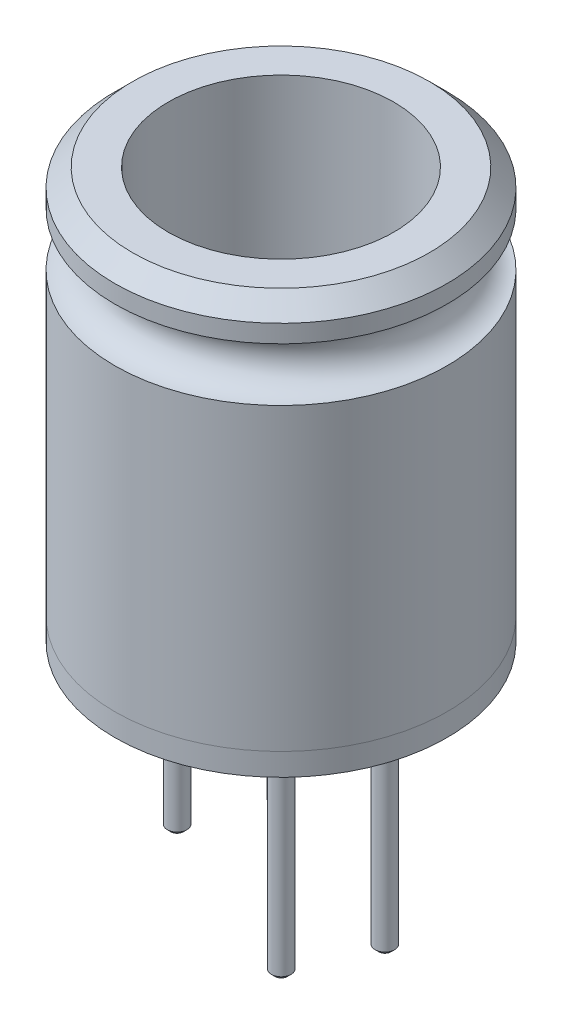
ISO-10303-21;
HEADER;
FILE_DESCRIPTION(('STEP AP214'),'2;1');
FILE_NAME('part.step','',(''),(''),'','','');
FILE_SCHEMA(('AUTOMOTIVE_DESIGN { 1 0 10303 214 1 1 1 1 }'));
ENDSEC;
DATA;
#1=APPLICATION_CONTEXT('core data for automotive mechanical design processes');
#2=APPLICATION_PROTOCOL_DEFINITION('international standard','automotive_design',2000,#1);
#3=PRODUCT_CONTEXT('',#1,'mechanical');
#4=PRODUCT('Part','Part','',(#3));
#5=PRODUCT_RELATED_PRODUCT_CATEGORY('part','',(#4));
#6=PRODUCT_DEFINITION_FORMATION('','',#4);
#7=PRODUCT_DEFINITION_CONTEXT('part definition',#1,'design');
#8=PRODUCT_DEFINITION('design','',#6,#7);
#9=PRODUCT_DEFINITION_SHAPE('','',#8);
#10=(LENGTH_UNIT() NAMED_UNIT(*) SI_UNIT(.MILLI.,.METRE.));
#11=(NAMED_UNIT(*) PLANE_ANGLE_UNIT() SI_UNIT($,.RADIAN.));
#12=(NAMED_UNIT(*) SI_UNIT($,.STERADIAN.) SOLID_ANGLE_UNIT());
#13=UNCERTAINTY_MEASURE_WITH_UNIT(LENGTH_MEASURE(1.E-05),#10,'distance_accuracy_value','');
#14=(GEOMETRIC_REPRESENTATION_CONTEXT(3) GLOBAL_UNCERTAINTY_ASSIGNED_CONTEXT((#13)) GLOBAL_UNIT_ASSIGNED_CONTEXT((#10,
#11,#12)) REPRESENTATION_CONTEXT('',''));
#15=CARTESIAN_POINT('',(0.,0.,0.));
#16=DIRECTION('',(0.,0.,1.));
#17=DIRECTION('',(1.,0.,0.));
#18=AXIS2_PLACEMENT_3D('',#15,#16,#17);
#19=CARTESIAN_POINT('',(-2.06475180106472,-6.,-2.06475180106472));
#20=DIRECTION('',(0.,-1.,0.));
#21=DIRECTION('',(0.,0.,-1.));
#22=AXIS2_PLACEMENT_3D('',#19,#20,#21);
#23=PLANE('',#22);
#24=CARTESIAN_POINT('',(-2.06475180106472,-6.00000000002865,-2.06475180106472));
#25=DIRECTION('',(0.,1.,0.));
#26=DIRECTION('',(0.,0.,1.));
#27=AXIS2_PLACEMENT_3D('',#24,#25,#26);
#28=CIRCLE('',#27,0.174999999948883);
#29=CARTESIAN_POINT('',(-2.06475180106472,-6.00000000002865,-1.88975180111584));
#30=VERTEX_POINT('',#29);
#31=EDGE_CURVE('P0_E18',#30,#30,#28,.T.);
#32=ORIENTED_EDGE('',*,*,#31,.F.);
#33=EDGE_LOOP('',(#32));
#34=FACE_BOUND('',#33,.T.);
#35=ADVANCED_FACE('P0_F15',(#34),#23,.T.);
#36=CARTESIAN_POINT('',(-2.06475180106472,-5.90000000005375,-2.06475180106472));
#37=DIRECTION('',(0.,1.,0.));
#38=DIRECTION('',(0.,0.,1.));
#39=AXIS2_PLACEMENT_3D('',#36,#37,#38);
#40=CONICAL_SURFACE('',#39,0.274999999923781,0.785398163397448);
#41=CARTESIAN_POINT('',(-2.06475180106472,-5.9,-2.06475180106472));
#42=DIRECTION('',(0.,1.,0.));
#43=DIRECTION('',(0.,0.,1.));
#44=AXIS2_PLACEMENT_3D('',#41,#42,#43);
#45=CIRCLE('',#44,0.275);
#46=CARTESIAN_POINT('',(-2.06475180106472,-5.9,-1.78975180106472));
#47=VERTEX_POINT('',#46);
#48=EDGE_CURVE('P0_E22',#47,#47,#45,.T.);
#49=ORIENTED_EDGE('',*,*,#48,.F.);
#50=EDGE_LOOP('',(#49));
#51=FACE_BOUND('',#50,.T.);
#52=ORIENTED_EDGE('',*,*,#31,.T.);
#53=EDGE_LOOP('',(#52));
#54=FACE_BOUND('',#53,.T.);
#55=ADVANCED_FACE('P0_F32',(#51,#54),#40,.T.);
#56=CARTESIAN_POINT('',(-2.06475180106472,0.,-2.06475180106472));
#57=DIRECTION('',(0.,-1.,0.));
#58=DIRECTION('',(0.,0.,-1.));
#59=AXIS2_PLACEMENT_3D('',#56,#57,#58);
#60=PLANE('',#59);
#61=CARTESIAN_POINT('',(-2.06475180106472,0.,-2.06475180106472));
#62=DIRECTION('',(0.,1.,0.));
#63=DIRECTION('',(0.,0.,1.));
#64=AXIS2_PLACEMENT_3D('',#61,#62,#63);
#65=CIRCLE('',#64,0.275);
#66=CARTESIAN_POINT('',(-2.06475180106472,0.,-1.78975180106472));
#67=VERTEX_POINT('',#66);
#68=EDGE_CURVE('P0_E10',#67,#67,#65,.F.);
#69=ORIENTED_EDGE('',*,*,#68,.F.);
#70=EDGE_LOOP('',(#69));
#71=FACE_BOUND('',#70,.T.);
#72=ADVANCED_FACE('P0_F39',(#71),#60,.F.);
#73=CARTESIAN_POINT('',(-2.06475180106472,-6.,-2.06475180106472));
#74=DIRECTION('',(0.,1.,0.));
#75=DIRECTION('',(0.,0.,1.));
#76=AXIS2_PLACEMENT_3D('',#73,#74,#75);
#77=CYLINDRICAL_SURFACE('',#76,0.275);
#78=ORIENTED_EDGE('',*,*,#68,.T.);
#79=EDGE_LOOP('',(#78));
#80=FACE_BOUND('',#79,.T.);
#81=ORIENTED_EDGE('',*,*,#48,.T.);
#82=EDGE_LOOP('',(#81));
#83=FACE_BOUND('',#82,.T.);
#84=ADVANCED_FACE('P0_F41',(#80,#83),#77,.T.);
#85=CLOSED_SHELL('',(#35,#55,#72,#84));
#86=MANIFOLD_SOLID_BREP('P0_B1',#85);
#87=CARTESIAN_POINT('',(0.,11.0500000001252,0.));
#88=DIRECTION('',(0.,-1.,0.));
#89=DIRECTION('',(0.,0.,-1.));
#90=AXIS2_PLACEMENT_3D('',#87,#88,#89);
#91=CONICAL_SURFACE('',#90,4.66999999991913,0.785398163397448);
#92=CARTESIAN_POINT('',(0.,11.05,0.));
#93=DIRECTION('',(0.,-1.,0.));
#94=DIRECTION('',(0.,0.,-1.));
#95=AXIS2_PLACEMENT_3D('',#92,#93,#94);
#96=CIRCLE('',#95,4.67);
#97=CARTESIAN_POINT('',(0.,11.05,-4.67));
#98=VERTEX_POINT('',#97);
#99=EDGE_CURVE('P1_E31',#98,#98,#96,.T.);
#100=ORIENTED_EDGE('',*,*,#99,.F.);
#101=EDGE_LOOP('',(#100));
#102=FACE_BOUND('',#101,.T.);
#103=CARTESIAN_POINT('',(0.,11.5500000000566,0.));
#104=DIRECTION('',(0.,-1.,0.));
#105=DIRECTION('',(0.,0.,-1.));
#106=AXIS2_PLACEMENT_3D('',#103,#104,#105);
#107=CIRCLE('',#106,4.16999999998779);
#108=CARTESIAN_POINT('',(0.,11.5500000000566,-4.16999999998779));
#109=VERTEX_POINT('',#108);
#110=EDGE_CURVE('P1_E18',#109,#109,#107,.F.);
#111=ORIENTED_EDGE('',*,*,#110,.F.);
#112=EDGE_LOOP('',(#111));
#113=FACE_BOUND('',#112,.T.);
#114=ADVANCED_FACE('P1_F15',(#102,#113),#91,.T.);
#115=CARTESIAN_POINT('',(0.,11.55,0.));
#116=DIRECTION('',(0.,-1.,0.));
#117=DIRECTION('',(0.,0.,-1.));
#118=AXIS2_PLACEMENT_3D('',#115,#116,#117);
#119=CYLINDRICAL_SURFACE('',#118,4.67);
#120=CARTESIAN_POINT('',(0.,10.55,0.));
#121=DIRECTION('',(0.,1.,0.));
#122=DIRECTION('',(0.,0.,1.));
#123=AXIS2_PLACEMENT_3D('',#120,#121,#122);
#124=CIRCLE('',#123,4.67);
#125=CARTESIAN_POINT('',(0.,10.55,4.67));
#126=VERTEX_POINT('',#125);
#127=EDGE_CURVE('P1_E36',#126,#126,#124,.T.);
#128=ORIENTED_EDGE('',*,*,#127,.T.);
#129=EDGE_LOOP('',(#128));
#130=FACE_BOUND('',#129,.T.);
#131=ORIENTED_EDGE('',*,*,#99,.T.);
#132=EDGE_LOOP('',(#131));
#133=FACE_BOUND('',#132,.T.);
#134=ADVANCED_FACE('P1_F59',(#130,#133),#119,.T.);
#135=CARTESIAN_POINT('',(0.,11.55,0.));
#136=DIRECTION('',(0.,1.,0.));
#137=DIRECTION('',(0.,0.,1.));
#138=AXIS2_PLACEMENT_3D('',#135,#136,#137);
#139=PLANE('',#138);
#140=CARTESIAN_POINT('',(0.,11.55,0.));
#141=DIRECTION('',(0.,-1.,0.));
#142=DIRECTION('',(0.,0.,-1.));
#143=AXIS2_PLACEMENT_3D('',#140,#141,#142);
#144=CIRCLE('',#143,3.17);
#145=CARTESIAN_POINT('',(0.,11.55,-3.17));
#146=VERTEX_POINT('',#145);
#147=EDGE_CURVE('P1_E34',#146,#146,#144,.T.);
#148=ORIENTED_EDGE('',*,*,#147,.T.);
#149=EDGE_LOOP('',(#148));
#150=FACE_BOUND('',#149,.T.);
#151=ORIENTED_EDGE('',*,*,#110,.T.);
#152=EDGE_LOOP('',(#151));
#153=FACE_BOUND('',#152,.T.);
#154=ADVANCED_FACE('P1_F56',(#150,#153),#139,.T.);
#155=CARTESIAN_POINT('',(0.,11.55,0.));
#156=DIRECTION('',(0.,-1.,0.));
#157=DIRECTION('',(0.,0.,-1.));
#158=AXIS2_PLACEMENT_3D('',#155,#156,#157);
#159=CYLINDRICAL_SURFACE('',#158,3.17);
#160=CARTESIAN_POINT('',(0.,0.63,0.));
#161=DIRECTION('',(0.,-1.,0.));
#162=DIRECTION('',(0.,0.,-1.));
#163=AXIS2_PLACEMENT_3D('',#160,#161,#162);
#164=CIRCLE('',#163,3.17);
#165=CARTESIAN_POINT('',(0.,0.63,-3.17));
#166=VERTEX_POINT('',#165);
#167=EDGE_CURVE('P1_E27',#166,#166,#164,.T.);
#168=ORIENTED_EDGE('',*,*,#167,.T.);
#169=EDGE_LOOP('',(#168));
#170=FACE_BOUND('',#169,.T.);
#171=ORIENTED_EDGE('',*,*,#147,.F.);
#172=EDGE_LOOP('',(#171));
#173=FACE_BOUND('',#172,.T.);
#174=ADVANCED_FACE('P1_F51',(#170,#173),#159,.F.);
#175=CARTESIAN_POINT('',(0.,9.8,0.));
#176=DIRECTION('',(0.,1.,0.));
#177=DIRECTION('',(0.,0.,1.));
#178=AXIS2_PLACEMENT_3D('',#175,#176,#177);
#179=TOROIDAL_SURFACE('',#178,4.67,0.75);
#180=ORIENTED_EDGE('',*,*,#127,.F.);
#181=EDGE_LOOP('',(#180));
#182=FACE_BOUND('',#181,.T.);
#183=CARTESIAN_POINT('',(0.,9.05,0.));
#184=DIRECTION('',(0.,-1.,0.));
#185=DIRECTION('',(0.,0.,-1.));
#186=AXIS2_PLACEMENT_3D('',#183,#184,#185);
#187=CIRCLE('',#186,4.67);
#188=CARTESIAN_POINT('',(0.,9.05,-4.67));
#189=VERTEX_POINT('',#188);
#190=EDGE_CURVE('P1_E22',#189,#189,#187,.T.);
#191=ORIENTED_EDGE('',*,*,#190,.F.);
#192=EDGE_LOOP('',(#191));
#193=FACE_BOUND('',#192,.T.);
#194=ADVANCED_FACE('P1_F46',(#182,#193),#179,.F.);
#195=CARTESIAN_POINT('',(0.,0.63,0.));
#196=DIRECTION('',(0.,1.,0.));
#197=DIRECTION('',(0.,0.,1.));
#198=AXIS2_PLACEMENT_3D('',#195,#196,#197);
#199=PLANE('',#198);
#200=ORIENTED_EDGE('',*,*,#167,.F.);
#201=EDGE_LOOP('',(#200));
#202=FACE_BOUND('',#201,.T.);
#203=CARTESIAN_POINT('',(0.,0.63,0.));
#204=DIRECTION('',(0.,-1.,0.));
#205=DIRECTION('',(0.,0.,-1.));
#206=AXIS2_PLACEMENT_3D('',#203,#204,#205);
#207=CIRCLE('',#206,4.67);
#208=CARTESIAN_POINT('',(0.,0.63,-4.67));
#209=VERTEX_POINT('',#208);
#210=EDGE_CURVE('P1_E10',#209,#209,#207,.F.);
#211=ORIENTED_EDGE('',*,*,#210,.F.);
#212=EDGE_LOOP('',(#211));
#213=FACE_BOUND('',#212,.T.);
#214=ADVANCED_FACE('P1_F50',(#202,#213),#199,.F.);
#215=CARTESIAN_POINT('',(0.,11.55,0.));
#216=DIRECTION('',(0.,-1.,0.));
#217=DIRECTION('',(0.,0.,-1.));
#218=AXIS2_PLACEMENT_3D('',#215,#216,#217);
#219=CYLINDRICAL_SURFACE('',#218,4.67);
#220=ORIENTED_EDGE('',*,*,#210,.T.);
#221=EDGE_LOOP('',(#220));
#222=FACE_BOUND('',#221,.T.);
#223=ORIENTED_EDGE('',*,*,#190,.T.);
#224=EDGE_LOOP('',(#223));
#225=FACE_BOUND('',#224,.T.);
#226=ADVANCED_FACE('P1_F67',(#222,#225),#219,.T.);
#227=CLOSED_SHELL('',(#114,#134,#154,#174,#194,#214,#226));
#228=MANIFOLD_SOLID_BREP('P1_B1',#227);
#229=CARTESIAN_POINT('',(2.06476688288851,-6.,2.05756901955737));
#230=DIRECTION('',(0.,-1.,0.));
#231=DIRECTION('',(0.,0.,-1.));
#232=AXIS2_PLACEMENT_3D('',#229,#230,#231);
#233=PLANE('',#232);
#234=CARTESIAN_POINT('',(2.06476688288851,-5.99999999997181,2.05756901955737));
#235=DIRECTION('',(0.,1.,0.));
#236=DIRECTION('',(0.,0.,1.));
#237=AXIS2_PLACEMENT_3D('',#234,#235,#236);
#238=CIRCLE('',#237,0.174999999940167);
#239=CARTESIAN_POINT('',(2.06476688288851,-5.99999999997181,2.23256901949753));
#240=VERTEX_POINT('',#239);
#241=EDGE_CURVE('P2_E18',#240,#240,#238,.T.);
#242=ORIENTED_EDGE('',*,*,#241,.F.);
#243=EDGE_LOOP('',(#242));
#244=FACE_BOUND('',#243,.T.);
#245=ADVANCED_FACE('P2_F15',(#244),#233,.T.);
#246=CARTESIAN_POINT('',(2.06476688288851,-5.90000000005375,2.05756901955737));
#247=DIRECTION('',(0.,1.,0.));
#248=DIRECTION('',(0.,0.,1.));
#249=AXIS2_PLACEMENT_3D('',#246,#247,#248);
#250=CONICAL_SURFACE('',#249,0.274999999858222,0.785398163397448);
#251=CARTESIAN_POINT('',(2.06476688288851,-5.9,2.05756901955737));
#252=DIRECTION('',(0.,1.,0.));
#253=DIRECTION('',(0.,0.,1.));
#254=AXIS2_PLACEMENT_3D('',#251,#252,#253);
#255=CIRCLE('',#254,0.275);
#256=CARTESIAN_POINT('',(2.06476688288851,-5.9,2.33256901955736));
#257=VERTEX_POINT('',#256);
#258=EDGE_CURVE('P2_E22',#257,#257,#255,.T.);
#259=ORIENTED_EDGE('',*,*,#258,.F.);
#260=EDGE_LOOP('',(#259));
#261=FACE_BOUND('',#260,.T.);
#262=ORIENTED_EDGE('',*,*,#241,.T.);
#263=EDGE_LOOP('',(#262));
#264=FACE_BOUND('',#263,.T.);
#265=ADVANCED_FACE('P2_F32',(#261,#264),#250,.T.);
#266=CARTESIAN_POINT('',(2.06476688288851,0.,2.05756901955737));
#267=DIRECTION('',(0.,-1.,0.));
#268=DIRECTION('',(0.,0.,-1.));
#269=AXIS2_PLACEMENT_3D('',#266,#267,#268);
#270=PLANE('',#269);
#271=CARTESIAN_POINT('',(2.06476688288851,0.,2.05756901955737));
#272=DIRECTION('',(0.,1.,0.));
#273=DIRECTION('',(0.,0.,1.));
#274=AXIS2_PLACEMENT_3D('',#271,#272,#273);
#275=CIRCLE('',#274,0.275);
#276=CARTESIAN_POINT('',(2.06476688288851,0.,2.33256901955736));
#277=VERTEX_POINT('',#276);
#278=EDGE_CURVE('P2_E10',#277,#277,#275,.F.);
#279=ORIENTED_EDGE('',*,*,#278,.F.);
#280=EDGE_LOOP('',(#279));
#281=FACE_BOUND('',#280,.T.);
#282=ADVANCED_FACE('P2_F39',(#281),#270,.F.);
#283=CARTESIAN_POINT('',(2.06476688288851,-6.,2.05756901955737));
#284=DIRECTION('',(0.,1.,0.));
#285=DIRECTION('',(0.,0.,1.));
#286=AXIS2_PLACEMENT_3D('',#283,#284,#285);
#287=CYLINDRICAL_SURFACE('',#286,0.275);
#288=ORIENTED_EDGE('',*,*,#278,.T.);
#289=EDGE_LOOP('',(#288));
#290=FACE_BOUND('',#289,.T.);
#291=ORIENTED_EDGE('',*,*,#258,.T.);
#292=EDGE_LOOP('',(#291));
#293=FACE_BOUND('',#292,.T.);
#294=ADVANCED_FACE('P2_F41',(#290,#293),#287,.T.);
#295=CLOSED_SHELL('',(#245,#265,#282,#294));
#296=MANIFOLD_SOLID_BREP('P2_B1',#295);
#297=CARTESIAN_POINT('',(-2.92,-6.,0.));
#298=DIRECTION('',(0.,-1.,0.));
#299=DIRECTION('',(0.,0.,-1.));
#300=AXIS2_PLACEMENT_3D('',#297,#298,#299);
#301=PLANE('',#300);
#302=CARTESIAN_POINT('',(-2.92,-5.99999999997181,0.));
#303=DIRECTION('',(0.,1.,0.));
#304=DIRECTION('',(-1.,0.,0.));
#305=AXIS2_PLACEMENT_3D('',#302,#303,#304);
#306=CIRCLE('',#305,0.175000000012915);
#307=CARTESIAN_POINT('',(-3.09500000001291,-5.99999999997181,0.));
#308=VERTEX_POINT('',#307);
#309=EDGE_CURVE('P3_E18',#308,#308,#306,.T.);
#310=ORIENTED_EDGE('',*,*,#309,.F.);
#311=EDGE_LOOP('',(#310));
#312=FACE_BOUND('',#311,.T.);
#313=ADVANCED_FACE('P3_F15',(#312),#301,.T.);
#314=CARTESIAN_POINT('',(-2.92,-5.89999999999691,0.));
#315=DIRECTION('',(0.,1.,0.));
#316=DIRECTION('',(-1.,0.,0.));
#317=AXIS2_PLACEMENT_3D('',#314,#315,#316);
#318=CONICAL_SURFACE('',#317,0.274999999930969,0.785398163113231);
#319=CARTESIAN_POINT('',(-2.92,-5.9,0.));
#320=DIRECTION('',(0.,1.,0.));
#321=DIRECTION('',(0.,0.,1.));
#322=AXIS2_PLACEMENT_3D('',#319,#320,#321);
#323=CIRCLE('',#322,0.275);
#324=CARTESIAN_POINT('',(-2.92,-5.9,0.275));
#325=VERTEX_POINT('',#324);
#326=EDGE_CURVE('P3_E22',#325,#325,#323,.T.);
#327=ORIENTED_EDGE('',*,*,#326,.F.);
#328=EDGE_LOOP('',(#327));
#329=FACE_BOUND('',#328,.T.);
#330=ORIENTED_EDGE('',*,*,#309,.T.);
#331=EDGE_LOOP('',(#330));
#332=FACE_BOUND('',#331,.T.);
#333=ADVANCED_FACE('P3_F32',(#329,#332),#318,.T.);
#334=CARTESIAN_POINT('',(-2.92,0.,0.));
#335=DIRECTION('',(0.,-1.,0.));
#336=DIRECTION('',(0.,0.,-1.));
#337=AXIS2_PLACEMENT_3D('',#334,#335,#336);
#338=PLANE('',#337);
#339=CARTESIAN_POINT('',(-2.92,0.,0.));
#340=DIRECTION('',(0.,1.,0.));
#341=DIRECTION('',(0.,0.,1.));
#342=AXIS2_PLACEMENT_3D('',#339,#340,#341);
#343=CIRCLE('',#342,0.275);
#344=CARTESIAN_POINT('',(-2.92,0.,0.275));
#345=VERTEX_POINT('',#344);
#346=EDGE_CURVE('P3_E10',#345,#345,#343,.F.);
#347=ORIENTED_EDGE('',*,*,#346,.F.);
#348=EDGE_LOOP('',(#347));
#349=FACE_BOUND('',#348,.T.);
#350=ADVANCED_FACE('P3_F39',(#349),#338,.F.);
#351=CARTESIAN_POINT('',(-2.92,-6.,0.));
#352=DIRECTION('',(0.,1.,0.));
#353=DIRECTION('',(0.,0.,1.));
#354=AXIS2_PLACEMENT_3D('',#351,#352,#353);
#355=CYLINDRICAL_SURFACE('',#354,0.275);
#356=ORIENTED_EDGE('',*,*,#346,.T.);
#357=EDGE_LOOP('',(#356));
#358=FACE_BOUND('',#357,.T.);
#359=ORIENTED_EDGE('',*,*,#326,.T.);
#360=EDGE_LOOP('',(#359));
#361=FACE_BOUND('',#360,.T.);
#362=ADVANCED_FACE('P3_F41',(#358,#361),#355,.T.);
#363=CLOSED_SHELL('',(#313,#333,#350,#362));
#364=MANIFOLD_SOLID_BREP('P3_B1',#363);
#365=CARTESIAN_POINT('',(2.92,-0.1,0.));
#366=DIRECTION('',(0.,-1.,0.));
#367=DIRECTION('',(0.,0.,-1.));
#368=AXIS2_PLACEMENT_3D('',#365,#366,#367);
#369=PLANE('',#368);
#370=CARTESIAN_POINT('',(2.92,-0.1,0.));
#371=DIRECTION('',(0.,1.,0.));
#372=DIRECTION('',(0.,0.,-1.));
#373=AXIS2_PLACEMENT_3D('',#370,#371,#372);
#374=CIRCLE('',#373,0.386794919243112);
#375=CARTESIAN_POINT('',(2.92,-0.1,-0.386794919243112));
#376=VERTEX_POINT('',#375);
#377=CARTESIAN_POINT('',(2.92,-0.1,0.386794919243112));
#378=VERTEX_POINT('',#377);
#379=EDGE_CURVE('P4_E27',#376,#378,#374,.T.);
#380=ORIENTED_EDGE('',*,*,#379,.F.);
#381=CARTESIAN_POINT('',(2.92,-0.1,0.));
#382=DIRECTION('',(0.,1.,0.));
#383=DIRECTION('',(0.,0.,1.));
#384=AXIS2_PLACEMENT_3D('',#381,#382,#383);
#385=CIRCLE('',#384,0.386794919243112);
#386=EDGE_CURVE('P4_E36',#378,#376,#385,.T.);
#387=ORIENTED_EDGE('',*,*,#386,.F.);
#388=EDGE_LOOP('',(#380,#387));
#389=FACE_BOUND('',#388,.T.);
#390=ADVANCED_FACE('P4_F17',(#389),#369,.T.);
#391=CARTESIAN_POINT('',(2.92,0.1,0.));
#392=DIRECTION('',(0.,1.,0.));
#393=DIRECTION('',(0.,0.,1.));
#394=AXIS2_PLACEMENT_3D('',#391,#392,#393);
#395=TOROIDAL_SURFACE('',#394,0.386794919243112,0.2);
#396=ORIENTED_EDGE('',*,*,#386,.T.);
#397=ORIENTED_EDGE('',*,*,#379,.T.);
#398=EDGE_LOOP('',(#396,#397));
#399=FACE_BOUND('',#398,.T.);
#400=CARTESIAN_POINT('',(2.92,0.,0.));
#401=DIRECTION('',(0.,1.,0.));
#402=DIRECTION('',(0.,0.,1.));
#403=AXIS2_PLACEMENT_3D('',#400,#401,#402);
#404=CIRCLE('',#403,0.56);
#405=CARTESIAN_POINT('',(2.92,0.,0.56));
#406=VERTEX_POINT('',#405);
#407=EDGE_CURVE('P4_E11',#406,#406,#404,.F.);
#408=ORIENTED_EDGE('',*,*,#407,.T.);
#409=EDGE_LOOP('',(#408));
#410=FACE_BOUND('',#409,.T.);
#411=ADVANCED_FACE('P4_F37',(#399,#410),#395,.T.);
#412=CARTESIAN_POINT('',(2.92,0.,0.));
#413=DIRECTION('',(0.,-1.,0.));
#414=DIRECTION('',(0.,0.,-1.));
#415=AXIS2_PLACEMENT_3D('',#412,#413,#414);
#416=PLANE('',#415);
#417=ORIENTED_EDGE('',*,*,#407,.F.);
#418=EDGE_LOOP('',(#417));
#419=FACE_BOUND('',#418,.T.);
#420=ADVANCED_FACE('P4_F71',(#419),#416,.F.);
#421=CLOSED_SHELL('',(#390,#411,#420));
#422=MANIFOLD_SOLID_BREP('P4_B1',#421);
#423=CARTESIAN_POINT('',(0.,0.63,0.));
#424=DIRECTION('',(0.,1.,0.));
#425=DIRECTION('',(0.,0.,1.));
#426=AXIS2_PLACEMENT_3D('',#423,#424,#425);
#427=PLANE('',#426);
#428=DIRECTION('',(-0.923879532507222,0.,-0.382683432374903));
#429=VECTOR('',#428,1.);
#430=CARTESIAN_POINT('',(-5.27398780877437,0.63,-1.75160039813017));
#431=LINE('',#430,#429);
#432=CARTESIAN_POINT('',(-4.9968239490222,0.63,-1.6367953684177));
#433=VERTEX_POINT('',#432);
#434=CARTESIAN_POINT('',(-4.44645181707023,0.63,-1.40882376700415));
#435=VERTEX_POINT('',#434);
#436=EDGE_CURVE('P5_E112',#433,#435,#431,.F.);
#437=ORIENTED_EDGE('',*,*,#436,.T.);
#438=DIRECTION('',(0.382683432374663,0.,-0.923879532507321));
#439=VECTOR('',#438,1.);
#440=CARTESIAN_POINT('',(-4.1403050711705,0.63,-2.14792739301));
#441=LINE('',#440,#439);
#442=CARTESIAN_POINT('',(-4.1403050711705,0.63,-2.14792739301));
#443=VERTEX_POINT('',#442);
#444=EDGE_CURVE('P5_E67',#443,#435,#441,.F.);
#445=ORIENTED_EDGE('',*,*,#444,.F.);
#446=DIRECTION('',(-0.923879532507324,0.,-0.382683432374657));
#447=VECTOR('',#446,1.);
#448=CARTESIAN_POINT('',(-4.96784106287454,0.63,-2.49070402413573));
#449=LINE('',#448,#447);
#450=CARTESIAN_POINT('',(-4.69067720312242,0.63,-2.37589899442336));
#451=VERTEX_POINT('',#450);
#452=EDGE_CURVE('P5_E81',#451,#443,#449,.F.);
#453=ORIENTED_EDGE('',*,*,#452,.F.);
#454=CARTESIAN_POINT('',(-4.80548223283482,0.63,-2.09873513467116));
#455=DIRECTION('',(0.,1.,0.));
#456=DIRECTION('',(0.,0.,1.));
#457=AXIS2_PLACEMENT_3D('',#454,#455,#456);
#458=CIRCLE('',#457,0.3);
#459=CARTESIAN_POINT('',(-5.08264609258698,0.63,-2.21354016438363));
#460=VERTEX_POINT('',#459);
#461=EDGE_CURVE('P5_E83',#460,#451,#458,.F.);
#462=ORIENTED_EDGE('',*,*,#461,.F.);
#463=DIRECTION('',(0.382683432374895,0.,-0.923879532507225));
#464=VECTOR('',#463,1.);
#465=CARTESIAN_POINT('',(-4.96784106287454,0.63,-2.49070402413573));
#466=LINE('',#465,#464);
#467=CARTESIAN_POINT('',(-5.1591827790619,0.63,-2.02876425788233));
#468=VERTEX_POINT('',#467);
#469=EDGE_CURVE('P5_E113',#460,#468,#466,.F.);
#470=ORIENTED_EDGE('',*,*,#469,.T.);
#471=CARTESIAN_POINT('',(-4.88201891930973,0.63,-1.91395922816986));
#472=DIRECTION('',(0.,-1.,0.));
#473=DIRECTION('',(0.,0.,-1.));
#474=AXIS2_PLACEMENT_3D('',#471,#472,#473);
#475=CIRCLE('',#474,0.3);
#476=EDGE_CURVE('P5_E20',#433,#468,#475,.T.);
#477=ORIENTED_EDGE('',*,*,#476,.F.);
#478=EDGE_LOOP('',(#437,#445,#453,#462,#470,#477));
#479=FACE_BOUND('',#478,.T.);
#480=ADVANCED_FACE('P5_F17',(#479),#427,.T.);
#481=CARTESIAN_POINT('',(-4.88201891930973,0.63,-1.91395922816986));
#482=DIRECTION('',(0.,-1.,0.));
#483=DIRECTION('',(0.,0.,-1.));
#484=AXIS2_PLACEMENT_3D('',#481,#482,#483);
#485=CYLINDRICAL_SURFACE('',#484,0.3);
#486=CARTESIAN_POINT('',(-4.88201891930973,0.,-1.91395922816986));
#487=DIRECTION('',(0.,-1.,0.));
#488=DIRECTION('',(0.,0.,-1.));
#489=AXIS2_PLACEMENT_3D('',#486,#487,#488);
#490=CIRCLE('',#489,0.3);
#491=CARTESIAN_POINT('',(-5.1591827790619,0.,-2.02876425788233));
#492=VERTEX_POINT('',#491);
#493=CARTESIAN_POINT('',(-4.9968239490222,0.,-1.6367953684177));
#494=VERTEX_POINT('',#493);
#495=EDGE_CURVE('P5_E99',#492,#494,#490,.F.);
#496=ORIENTED_EDGE('',*,*,#495,.T.);
#497=DIRECTION('',(0.,1.,0.));
#498=VECTOR('',#497,1.);
#499=CARTESIAN_POINT('',(-4.9968239490222,0.63,-1.6367953684177));
#500=LINE('',#499,#498);
#501=EDGE_CURVE('P5_E109',#494,#433,#500,.T.);
#502=ORIENTED_EDGE('',*,*,#501,.T.);
#503=ORIENTED_EDGE('',*,*,#476,.T.);
#504=DIRECTION('',(0.,1.,0.));
#505=VECTOR('',#504,1.);
#506=CARTESIAN_POINT('',(-5.1591827790619,0.63,-2.02876425788233));
#507=LINE('',#506,#505);
#508=EDGE_CURVE('P5_E128',#468,#492,#507,.F.);
#509=ORIENTED_EDGE('',*,*,#508,.T.);
#510=EDGE_LOOP('',(#496,#502,#503,#509));
#511=FACE_BOUND('',#510,.T.);
#512=ADVANCED_FACE('P5_F189',(#511),#485,.T.);
#513=CARTESIAN_POINT('',(-5.27398780877437,0.63,-1.75160039813017));
#514=DIRECTION('',(0.382683432374903,0.,-0.923879532507222));
#515=DIRECTION('',(-0.923879532507222,0.,-0.382683432374903));
#516=AXIS2_PLACEMENT_3D('',#513,#514,#515);
#517=PLANE('',#516);
#518=ORIENTED_EDGE('',*,*,#501,.F.);
#519=DIRECTION('',(0.923879532507222,0.,0.382683432374903));
#520=VECTOR('',#519,1.);
#521=CARTESIAN_POINT('',(-4.9968239490222,0.,-1.6367953684177));
#522=LINE('',#521,#520);
#523=CARTESIAN_POINT('',(-4.44645181707023,0.,-1.40882376700415));
#524=VERTEX_POINT('',#523);
#525=EDGE_CURVE('P5_E97',#494,#524,#522,.T.);
#526=ORIENTED_EDGE('',*,*,#525,.T.);
#527=DIRECTION('',(0.,1.,0.));
#528=VECTOR('',#527,1.);
#529=CARTESIAN_POINT('',(-4.44645181707023,0.63,-1.40882376700415));
#530=LINE('',#529,#528);
#531=EDGE_CURVE('P5_E96',#435,#524,#530,.F.);
#532=ORIENTED_EDGE('',*,*,#531,.F.);
#533=ORIENTED_EDGE('',*,*,#436,.F.);
#534=EDGE_LOOP('',(#518,#526,#532,#533));
#535=FACE_BOUND('',#534,.T.);
#536=ADVANCED_FACE('P5_F180',(#535),#517,.F.);
#537=CARTESIAN_POINT('',(-4.1403050711705,0.63,-2.14792739301));
#538=DIRECTION('',(0.923879532507321,0.,0.382683432374663));
#539=DIRECTION('',(0.382683432374663,0.,-0.923879532507321));
#540=AXIS2_PLACEMENT_3D('',#537,#538,#539);
#541=PLANE('',#540);
#542=ORIENTED_EDGE('',*,*,#444,.T.);
#543=ORIENTED_EDGE('',*,*,#531,.T.);
#544=DIRECTION('',(0.382683432374663,0.,-0.923879532507321));
#545=VECTOR('',#544,1.);
#546=CARTESIAN_POINT('',(-4.44645181707023,0.,-1.40882376700415));
#547=LINE('',#546,#545);
#548=CARTESIAN_POINT('',(-4.1403050711705,0.,-2.14792739301));
#549=VERTEX_POINT('',#548);
#550=EDGE_CURVE('P5_E90',#524,#549,#547,.T.);
#551=ORIENTED_EDGE('',*,*,#550,.T.);
#552=DIRECTION('',(0.,1.,0.));
#553=VECTOR('',#552,1.);
#554=CARTESIAN_POINT('',(-4.1403050711705,0.63,-2.14792739301));
#555=LINE('',#554,#553);
#556=EDGE_CURVE('P5_E75',#443,#549,#555,.F.);
#557=ORIENTED_EDGE('',*,*,#556,.F.);
#558=EDGE_LOOP('',(#542,#543,#551,#557));
#559=FACE_BOUND('',#558,.T.);
#560=ADVANCED_FACE('P5_F94',(#559),#541,.T.);
#561=CARTESIAN_POINT('',(-4.96784106287454,0.63,-2.49070402413573));
#562=DIRECTION('',(0.382683432374657,0.,-0.923879532507324));
#563=DIRECTION('',(-0.923879532507324,0.,-0.382683432374657));
#564=AXIS2_PLACEMENT_3D('',#561,#562,#563);
#565=PLANE('',#564);
#566=ORIENTED_EDGE('',*,*,#452,.T.);
#567=ORIENTED_EDGE('',*,*,#556,.T.);
#568=DIRECTION('',(-0.923879532507324,0.,-0.382683432374657));
#569=VECTOR('',#568,1.);
#570=CARTESIAN_POINT('',(-4.1403050711705,0.,-2.14792739301));
#571=LINE('',#570,#569);
#572=CARTESIAN_POINT('',(-4.69067720312242,0.,-2.37589899442336));
#573=VERTEX_POINT('',#572);
#574=EDGE_CURVE('P5_E79',#549,#573,#571,.T.);
#575=ORIENTED_EDGE('',*,*,#574,.T.);
#576=DIRECTION('',(0.,1.,0.));
#577=VECTOR('',#576,1.);
#578=CARTESIAN_POINT('',(-4.69067720312242,0.63,-2.37589899442336));
#579=LINE('',#578,#577);
#580=EDGE_CURVE('P5_E126',#451,#573,#579,.F.);
#581=ORIENTED_EDGE('',*,*,#580,.F.);
#582=EDGE_LOOP('',(#566,#567,#575,#581));
#583=FACE_BOUND('',#582,.T.);
#584=ADVANCED_FACE('P5_F77',(#583),#565,.T.);
#585=CARTESIAN_POINT('',(-4.80548223283482,0.63,-2.09873513467116));
#586=DIRECTION('',(0.,1.,0.));
#587=DIRECTION('',(0.,0.,1.));
#588=AXIS2_PLACEMENT_3D('',#585,#586,#587);
#589=CYLINDRICAL_SURFACE('',#588,0.3);
#590=CARTESIAN_POINT('',(-4.80548223283482,0.,-2.09873513467116));
#591=DIRECTION('',(0.,1.,0.));
#592=DIRECTION('',(0.,0.,1.));
#593=AXIS2_PLACEMENT_3D('',#590,#591,#592);
#594=CIRCLE('',#593,0.3);
#595=CARTESIAN_POINT('',(-5.08264609258698,0.,-2.21354016438363));
#596=VERTEX_POINT('',#595);
#597=EDGE_CURVE('P5_E26',#573,#596,#594,.T.);
#598=ORIENTED_EDGE('',*,*,#597,.T.);
#599=DIRECTION('',(0.,1.,0.));
#600=VECTOR('',#599,1.);
#601=CARTESIAN_POINT('',(-5.08264609258698,0.63,-2.21354016438363));
#602=LINE('',#601,#600);
#603=EDGE_CURVE('P5_E34',#596,#460,#602,.T.);
#604=ORIENTED_EDGE('',*,*,#603,.T.);
#605=ORIENTED_EDGE('',*,*,#461,.T.);
#606=ORIENTED_EDGE('',*,*,#580,.T.);
#607=EDGE_LOOP('',(#598,#604,#605,#606));
#608=FACE_BOUND('',#607,.T.);
#609=ADVANCED_FACE('P5_F137',(#608),#589,.T.);
#610=CARTESIAN_POINT('',(-4.96784106287454,0.63,-2.49070402413573));
#611=DIRECTION('',(0.923879532507225,0.,0.382683432374895));
#612=DIRECTION('',(0.382683432374895,0.,-0.923879532507225));
#613=AXIS2_PLACEMENT_3D('',#610,#611,#612);
#614=PLANE('',#613);
#615=ORIENTED_EDGE('',*,*,#603,.F.);
#616=DIRECTION('',(-0.382683432374895,0.,0.923879532507225));
#617=VECTOR('',#616,1.);
#618=CARTESIAN_POINT('',(-5.08264609258698,0.,-2.21354016438363));
#619=LINE('',#618,#617);
#620=EDGE_CURVE('P5_E11',#596,#492,#619,.T.);
#621=ORIENTED_EDGE('',*,*,#620,.T.);
#622=ORIENTED_EDGE('',*,*,#508,.F.);
#623=ORIENTED_EDGE('',*,*,#469,.F.);
#624=EDGE_LOOP('',(#615,#621,#622,#623));
#625=FACE_BOUND('',#624,.T.);
#626=ADVANCED_FACE('P5_F139',(#625),#614,.F.);
#627=CARTESIAN_POINT('',(0.,0.,0.));
#628=DIRECTION('',(0.,1.,0.));
#629=DIRECTION('',(0.,0.,1.));
#630=AXIS2_PLACEMENT_3D('',#627,#628,#629);
#631=PLANE('',#630);
#632=ORIENTED_EDGE('',*,*,#597,.F.);
#633=ORIENTED_EDGE('',*,*,#574,.F.);
#634=ORIENTED_EDGE('',*,*,#550,.F.);
#635=ORIENTED_EDGE('',*,*,#525,.F.);
#636=ORIENTED_EDGE('',*,*,#495,.F.);
#637=ORIENTED_EDGE('',*,*,#620,.F.);
#638=EDGE_LOOP('',(#632,#633,#634,#635,#636,#637));
#639=FACE_BOUND('',#638,.T.);
#640=ADVANCED_FACE('P5_F88',(#639),#631,.F.);
#641=CLOSED_SHELL('',(#480,#512,#536,#560,#584,#609,#626,#640));
#642=MANIFOLD_SOLID_BREP('P5_B1',#641);
#643=CARTESIAN_POINT('',(2.92,-6.,0.));
#644=DIRECTION('',(0.,-1.,0.));
#645=DIRECTION('',(0.,0.,-1.));
#646=AXIS2_PLACEMENT_3D('',#643,#644,#645);
#647=PLANE('',#646);
#648=CARTESIAN_POINT('',(2.92,-5.99999999997181,0.));
#649=DIRECTION('',(0.,1.,0.));
#650=DIRECTION('',(-1.,0.,0.));
#651=AXIS2_PLACEMENT_3D('',#648,#649,#650);
#652=CIRCLE('',#651,0.175000000012915);
#653=CARTESIAN_POINT('',(2.74499999998709,-5.99999999997181,0.));
#654=VERTEX_POINT('',#653);
#655=EDGE_CURVE('P6_E18',#654,#654,#652,.T.);
#656=ORIENTED_EDGE('',*,*,#655,.F.);
#657=EDGE_LOOP('',(#656));
#658=FACE_BOUND('',#657,.T.);
#659=ADVANCED_FACE('P6_F15',(#658),#647,.T.);
#660=CARTESIAN_POINT('',(2.92,-5.89999999999691,0.));
#661=DIRECTION('',(0.,1.,0.));
#662=DIRECTION('',(-1.,0.,0.));
#663=AXIS2_PLACEMENT_3D('',#660,#661,#662);
#664=CONICAL_SURFACE('',#663,0.274999999930969,0.785398163113231);
#665=CARTESIAN_POINT('',(2.92,-5.9,0.));
#666=DIRECTION('',(0.,1.,0.));
#667=DIRECTION('',(0.,0.,1.));
#668=AXIS2_PLACEMENT_3D('',#665,#666,#667);
#669=CIRCLE('',#668,0.275);
#670=CARTESIAN_POINT('',(2.92,-5.9,0.275));
#671=VERTEX_POINT('',#670);
#672=EDGE_CURVE('P6_E22',#671,#671,#669,.T.);
#673=ORIENTED_EDGE('',*,*,#672,.F.);
#674=EDGE_LOOP('',(#673));
#675=FACE_BOUND('',#674,.T.);
#676=ORIENTED_EDGE('',*,*,#655,.T.);
#677=EDGE_LOOP('',(#676));
#678=FACE_BOUND('',#677,.T.);
#679=ADVANCED_FACE('P6_F32',(#675,#678),#664,.T.);
#680=CARTESIAN_POINT('',(2.92,0.,0.));
#681=DIRECTION('',(0.,-1.,0.));
#682=DIRECTION('',(0.,0.,-1.));
#683=AXIS2_PLACEMENT_3D('',#680,#681,#682);
#684=PLANE('',#683);
#685=CARTESIAN_POINT('',(2.92,0.,0.));
#686=DIRECTION('',(0.,1.,0.));
#687=DIRECTION('',(0.,0.,1.));
#688=AXIS2_PLACEMENT_3D('',#685,#686,#687);
#689=CIRCLE('',#688,0.275);
#690=CARTESIAN_POINT('',(2.92,0.,0.275));
#691=VERTEX_POINT('',#690);
#692=EDGE_CURVE('P6_E10',#691,#691,#689,.F.);
#693=ORIENTED_EDGE('',*,*,#692,.F.);
#694=EDGE_LOOP('',(#693));
#695=FACE_BOUND('',#694,.T.);
#696=ADVANCED_FACE('P6_F39',(#695),#684,.F.);
#697=CARTESIAN_POINT('',(2.92,-6.,0.));
#698=DIRECTION('',(0.,1.,0.));
#699=DIRECTION('',(0.,0.,1.));
#700=AXIS2_PLACEMENT_3D('',#697,#698,#699);
#701=CYLINDRICAL_SURFACE('',#700,0.275);
#702=ORIENTED_EDGE('',*,*,#692,.T.);
#703=EDGE_LOOP('',(#702));
#704=FACE_BOUND('',#703,.T.);
#705=ORIENTED_EDGE('',*,*,#672,.T.);
#706=EDGE_LOOP('',(#705));
#707=FACE_BOUND('',#706,.T.);
#708=ADVANCED_FACE('P6_F41',(#704,#707),#701,.T.);
#709=CLOSED_SHELL('',(#659,#679,#696,#708));
#710=MANIFOLD_SOLID_BREP('P6_B1',#709);
#711=CARTESIAN_POINT('',(0.,0.63,0.));
#712=DIRECTION('',(0.,-1.,0.));
#713=DIRECTION('',(0.,0.,-1.));
#714=AXIS2_PLACEMENT_3D('',#711,#712,#713);
#715=PLANE('',#714);
#716=CARTESIAN_POINT('',(0.,0.63,0.));
#717=DIRECTION('',(0.,1.,0.));
#718=DIRECTION('',(0.,0.,1.));
#719=AXIS2_PLACEMENT_3D('',#716,#717,#718);
#720=CIRCLE('',#719,3.17);
#721=CARTESIAN_POINT('',(0.,0.629999999999978,3.17));
#722=VERTEX_POINT('',#721);
#723=CARTESIAN_POINT('',(0.,0.630000000000022,-3.17));
#724=VERTEX_POINT('',#723);
#725=EDGE_CURVE('P7_E20',#722,#724,#720,.T.);
#726=ORIENTED_EDGE('',*,*,#725,.F.);
#727=CARTESIAN_POINT('',(0.,0.63,0.));
#728=DIRECTION('',(0.,-1.,0.));
#729=DIRECTION('',(0.,0.,1.));
#730=AXIS2_PLACEMENT_3D('',#727,#728,#729);
#731=CIRCLE('',#730,3.17);
#732=EDGE_CURVE('P7_E11',#724,#722,#731,.F.);
#733=ORIENTED_EDGE('',*,*,#732,.F.);
#734=EDGE_LOOP('',(#726,#733));
#735=FACE_BOUND('',#734,.T.);
#736=ADVANCED_FACE('P7_F17',(#735),#715,.T.);
#737=CARTESIAN_POINT('',(0.,0.63,0.));
#738=DIRECTION('',(0.,0.,1.));
#739=DIRECTION('',(1.,0.,0.));
#740=AXIS2_PLACEMENT_3D('',#737,#738,#739);
#741=SPHERICAL_SURFACE('',#740,3.17);
#742=ORIENTED_EDGE('',*,*,#725,.T.);
#743=ORIENTED_EDGE('',*,*,#732,.T.);
#744=EDGE_LOOP('',(#742,#743));
#745=FACE_BOUND('',#744,.T.);
#746=ADVANCED_FACE('P7_F31',(#745),#741,.T.);
#747=CLOSED_SHELL('',(#736,#746));
#748=MANIFOLD_SOLID_BREP('P7_B1',#747);
#749=CARTESIAN_POINT('',(0.,0.,0.));
#750=DIRECTION('',(0.,1.,0.));
#751=DIRECTION('',(0.,0.,1.));
#752=AXIS2_PLACEMENT_3D('',#749,#750,#751);
#753=PLANE('',#752);
#754=CARTESIAN_POINT('',(0.,0.,0.));
#755=DIRECTION('',(0.,-1.,0.));
#756=DIRECTION('',(0.,0.,-1.));
#757=AXIS2_PLACEMENT_3D('',#754,#755,#756);
#758=CIRCLE('',#757,4.67);
#759=CARTESIAN_POINT('',(0.,0.,-4.67));
#760=VERTEX_POINT('',#759);
#761=EDGE_CURVE('P8_E18',#760,#760,#758,.F.);
#762=ORIENTED_EDGE('',*,*,#761,.F.);
#763=EDGE_LOOP('',(#762));
#764=FACE_BOUND('',#763,.T.);
#765=ADVANCED_FACE('P8_F15',(#764),#753,.F.);
#766=CARTESIAN_POINT('',(0.,0.63,0.));
#767=DIRECTION('',(0.,-1.,0.));
#768=DIRECTION('',(0.,0.,-1.));
#769=AXIS2_PLACEMENT_3D('',#766,#767,#768);
#770=CYLINDRICAL_SURFACE('',#769,4.67);
#771=ORIENTED_EDGE('',*,*,#761,.T.);
#772=EDGE_LOOP('',(#771));
#773=FACE_BOUND('',#772,.T.);
#774=CARTESIAN_POINT('',(0.,0.63,0.));
#775=DIRECTION('',(0.,-1.,0.));
#776=DIRECTION('',(0.,0.,-1.));
#777=AXIS2_PLACEMENT_3D('',#774,#775,#776);
#778=CIRCLE('',#777,4.67);
#779=CARTESIAN_POINT('',(0.,0.63,-4.67));
#780=VERTEX_POINT('',#779);
#781=EDGE_CURVE('P8_E10',#780,#780,#778,.F.);
#782=ORIENTED_EDGE('',*,*,#781,.F.);
#783=EDGE_LOOP('',(#782));
#784=FACE_BOUND('',#783,.T.);
#785=ADVANCED_FACE('P8_F27',(#773,#784),#770,.T.);
#786=CARTESIAN_POINT('',(0.,0.63,0.));
#787=DIRECTION('',(0.,1.,0.));
#788=DIRECTION('',(0.,0.,1.));
#789=AXIS2_PLACEMENT_3D('',#786,#787,#788);
#790=PLANE('',#789);
#791=ORIENTED_EDGE('',*,*,#781,.T.);
#792=EDGE_LOOP('',(#791));
#793=FACE_BOUND('',#792,.T.);
#794=ADVANCED_FACE('P8_F35',(#793),#790,.T.);
#795=CLOSED_SHELL('',(#765,#785,#794));
#796=MANIFOLD_SOLID_BREP('P8_B1',#795);
#797=CARTESIAN_POINT('',(2.06476688288851,-0.1,2.05756901955737));
#798=DIRECTION('',(0.,-1.,0.));
#799=DIRECTION('',(0.,0.,-1.));
#800=AXIS2_PLACEMENT_3D('',#797,#798,#799);
#801=PLANE('',#800);
#802=CARTESIAN_POINT('',(2.06476688288851,-0.1,2.05756901955737));
#803=DIRECTION('',(0.,1.,0.));
#804=DIRECTION('',(0.,0.,-1.));
#805=AXIS2_PLACEMENT_3D('',#802,#803,#804);
#806=CIRCLE('',#805,0.386794919243112);
#807=CARTESIAN_POINT('',(2.06476688288851,-0.1,1.67077410031425));
#808=VERTEX_POINT('',#807);
#809=CARTESIAN_POINT('',(2.06476688288851,-0.1,2.44436393880048));
#810=VERTEX_POINT('',#809);
#811=EDGE_CURVE('P9_E27',#808,#810,#806,.T.);
#812=ORIENTED_EDGE('',*,*,#811,.F.);
#813=CARTESIAN_POINT('',(2.06476688288851,-0.1,2.05756901955737));
#814=DIRECTION('',(0.,1.,0.));
#815=DIRECTION('',(0.,0.,1.));
#816=AXIS2_PLACEMENT_3D('',#813,#814,#815);
#817=CIRCLE('',#816,0.386794919243112);
#818=EDGE_CURVE('P9_E36',#810,#808,#817,.T.);
#819=ORIENTED_EDGE('',*,*,#818,.F.);
#820=EDGE_LOOP('',(#812,#819));
#821=FACE_BOUND('',#820,.T.);
#822=ADVANCED_FACE('P9_F17',(#821),#801,.T.);
#823=CARTESIAN_POINT('',(2.06476688288851,0.1,2.05756901955737));
#824=DIRECTION('',(0.,1.,0.));
#825=DIRECTION('',(0.,0.,1.));
#826=AXIS2_PLACEMENT_3D('',#823,#824,#825);
#827=TOROIDAL_SURFACE('',#826,0.386794919243112,0.2);
#828=ORIENTED_EDGE('',*,*,#818,.T.);
#829=ORIENTED_EDGE('',*,*,#811,.T.);
#830=EDGE_LOOP('',(#828,#829));
#831=FACE_BOUND('',#830,.T.);
#832=CARTESIAN_POINT('',(2.06476688288851,0.,2.05756901955737));
#833=DIRECTION('',(0.,1.,0.));
#834=DIRECTION('',(0.,0.,1.));
#835=AXIS2_PLACEMENT_3D('',#832,#833,#834);
#836=CIRCLE('',#835,0.56);
#837=CARTESIAN_POINT('',(2.06476688288851,0.,2.61756901955737));
#838=VERTEX_POINT('',#837);
#839=EDGE_CURVE('P9_E11',#838,#838,#836,.F.);
#840=ORIENTED_EDGE('',*,*,#839,.T.);
#841=EDGE_LOOP('',(#840));
#842=FACE_BOUND('',#841,.T.);
#843=ADVANCED_FACE('P9_F37',(#831,#842),#827,.T.);
#844=CARTESIAN_POINT('',(2.06476688288851,0.,2.05756901955737));
#845=DIRECTION('',(0.,-1.,0.));
#846=DIRECTION('',(0.,0.,-1.));
#847=AXIS2_PLACEMENT_3D('',#844,#845,#846);
#848=PLANE('',#847);
#849=ORIENTED_EDGE('',*,*,#839,.F.);
#850=EDGE_LOOP('',(#849));
#851=FACE_BOUND('',#850,.T.);
#852=ADVANCED_FACE('P9_F71',(#851),#848,.F.);
#853=CLOSED_SHELL('',(#822,#843,#852));
#854=MANIFOLD_SOLID_BREP('P9_B1',#853);
#855=CARTESIAN_POINT('',(-2.92,-0.1,0.));
#856=DIRECTION('',(0.,-1.,0.));
#857=DIRECTION('',(0.,0.,-1.));
#858=AXIS2_PLACEMENT_3D('',#855,#856,#857);
#859=PLANE('',#858);
#860=CARTESIAN_POINT('',(-2.92,-0.1,0.));
#861=DIRECTION('',(0.,1.,0.));
#862=DIRECTION('',(0.,0.,-1.));
#863=AXIS2_PLACEMENT_3D('',#860,#861,#862);
#864=CIRCLE('',#863,0.386794919243112);
#865=CARTESIAN_POINT('',(-2.92,-0.1,-0.386794919243112));
#866=VERTEX_POINT('',#865);
#867=CARTESIAN_POINT('',(-2.92,-0.1,0.386794919243112));
#868=VERTEX_POINT('',#867);
#869=EDGE_CURVE('P10_E27',#866,#868,#864,.T.);
#870=ORIENTED_EDGE('',*,*,#869,.F.);
#871=CARTESIAN_POINT('',(-2.92,-0.1,0.));
#872=DIRECTION('',(0.,1.,0.));
#873=DIRECTION('',(0.,0.,1.));
#874=AXIS2_PLACEMENT_3D('',#871,#872,#873);
#875=CIRCLE('',#874,0.386794919243112);
#876=EDGE_CURVE('P10_E36',#868,#866,#875,.T.);
#877=ORIENTED_EDGE('',*,*,#876,.F.);
#878=EDGE_LOOP('',(#870,#877));
#879=FACE_BOUND('',#878,.T.);
#880=ADVANCED_FACE('P10_F17',(#879),#859,.T.);
#881=CARTESIAN_POINT('',(-2.92,0.1,0.));
#882=DIRECTION('',(0.,1.,0.));
#883=DIRECTION('',(0.,0.,1.));
#884=AXIS2_PLACEMENT_3D('',#881,#882,#883);
#885=TOROIDAL_SURFACE('',#884,0.386794919243112,0.2);
#886=ORIENTED_EDGE('',*,*,#876,.T.);
#887=ORIENTED_EDGE('',*,*,#869,.T.);
#888=EDGE_LOOP('',(#886,#887));
#889=FACE_BOUND('',#888,.T.);
#890=CARTESIAN_POINT('',(-2.92,0.,0.));
#891=DIRECTION('',(0.,1.,0.));
#892=DIRECTION('',(0.,0.,1.));
#893=AXIS2_PLACEMENT_3D('',#890,#891,#892);
#894=CIRCLE('',#893,0.56);
#895=CARTESIAN_POINT('',(-2.92,0.,0.56));
#896=VERTEX_POINT('',#895);
#897=EDGE_CURVE('P10_E11',#896,#896,#894,.F.);
#898=ORIENTED_EDGE('',*,*,#897,.T.);
#899=EDGE_LOOP('',(#898));
#900=FACE_BOUND('',#899,.T.);
#901=ADVANCED_FACE('P10_F37',(#889,#900),#885,.T.);
#902=CARTESIAN_POINT('',(-2.92,0.,0.));
#903=DIRECTION('',(0.,-1.,0.));
#904=DIRECTION('',(0.,0.,-1.));
#905=AXIS2_PLACEMENT_3D('',#902,#903,#904);
#906=PLANE('',#905);
#907=ORIENTED_EDGE('',*,*,#897,.F.);
#908=EDGE_LOOP('',(#907));
#909=FACE_BOUND('',#908,.T.);
#910=ADVANCED_FACE('P10_F71',(#909),#906,.F.);
#911=CLOSED_SHELL('',(#880,#901,#910));
#912=MANIFOLD_SOLID_BREP('P10_B1',#911);
#913=CARTESIAN_POINT('',(-2.06475180106472,-0.1,-2.06475180106472));
#914=DIRECTION('',(0.,-1.,0.));
#915=DIRECTION('',(0.,0.,-1.));
#916=AXIS2_PLACEMENT_3D('',#913,#914,#915);
#917=PLANE('',#916);
#918=CARTESIAN_POINT('',(-2.06475180106472,-0.1,-2.06475180106472));
#919=DIRECTION('',(0.,1.,0.));
#920=DIRECTION('',(0.,0.,-1.));
#921=AXIS2_PLACEMENT_3D('',#918,#919,#920);
#922=CIRCLE('',#921,0.386794919243112);
#923=CARTESIAN_POINT('',(-2.06475180106472,-0.1,-2.45154672030783));
#924=VERTEX_POINT('',#923);
#925=CARTESIAN_POINT('',(-2.06475180106472,-0.1,-1.67795688182161));
#926=VERTEX_POINT('',#925);
#927=EDGE_CURVE('P11_E26',#924,#926,#922,.T.);
#928=ORIENTED_EDGE('',*,*,#927,.F.);
#929=CARTESIAN_POINT('',(-2.06475180106472,-0.1,-2.06475180106472));
#930=DIRECTION('',(0.,1.,0.));
#931=DIRECTION('',(0.,0.,1.));
#932=AXIS2_PLACEMENT_3D('',#929,#930,#931);
#933=CIRCLE('',#932,0.386794919243112);
#934=EDGE_CURVE('P11_E35',#926,#924,#933,.T.);
#935=ORIENTED_EDGE('',*,*,#934,.F.);
#936=EDGE_LOOP('',(#928,#935));
#937=FACE_BOUND('',#936,.T.);
#938=ADVANCED_FACE('P11_F16',(#937),#917,.T.);
#939=CARTESIAN_POINT('',(-2.06475180106472,0.1,-2.06475180106472));
#940=DIRECTION('',(0.,1.,0.));
#941=DIRECTION('',(0.,0.,1.));
#942=AXIS2_PLACEMENT_3D('',#939,#940,#941);
#943=TOROIDAL_SURFACE('',#942,0.386794919243112,0.2);
#944=ORIENTED_EDGE('',*,*,#934,.T.);
#945=ORIENTED_EDGE('',*,*,#927,.T.);
#946=EDGE_LOOP('',(#944,#945));
#947=FACE_BOUND('',#946,.T.);
#948=CARTESIAN_POINT('',(-2.06475180106472,0.,-2.06475180106472));
#949=DIRECTION('',(0.,1.,0.));
#950=DIRECTION('',(0.,0.,1.));
#951=AXIS2_PLACEMENT_3D('',#948,#949,#950);
#952=CIRCLE('',#951,0.56);
#953=CARTESIAN_POINT('',(-2.06475180106472,0.,-1.50475180106472));
#954=VERTEX_POINT('',#953);
#955=EDGE_CURVE('P11_E10',#954,#954,#952,.F.);
#956=ORIENTED_EDGE('',*,*,#955,.T.);
#957=EDGE_LOOP('',(#956));
#958=FACE_BOUND('',#957,.T.);
#959=ADVANCED_FACE('P11_F36',(#947,#958),#943,.T.);
#960=CARTESIAN_POINT('',(-2.06475180106472,0.,-2.06475180106472));
#961=DIRECTION('',(0.,-1.,0.));
#962=DIRECTION('',(0.,0.,-1.));
#963=AXIS2_PLACEMENT_3D('',#960,#961,#962);
#964=PLANE('',#963);
#965=ORIENTED_EDGE('',*,*,#955,.F.);
#966=EDGE_LOOP('',(#965));
#967=FACE_BOUND('',#966,.T.);
#968=ADVANCED_FACE('P11_F70',(#967),#964,.F.);
#969=CLOSED_SHELL('',(#938,#959,#968));
#970=MANIFOLD_SOLID_BREP('P11_B1',#969);
#971=ADVANCED_BREP_SHAPE_REPRESENTATION('',(#18,#86,#228,#296,#364,#422,#642,#710,#748,#796,
#854,#912,#970),#14);
#972=SHAPE_DEFINITION_REPRESENTATION(#9,#971);
ENDSEC;
END-ISO-10303-21;
